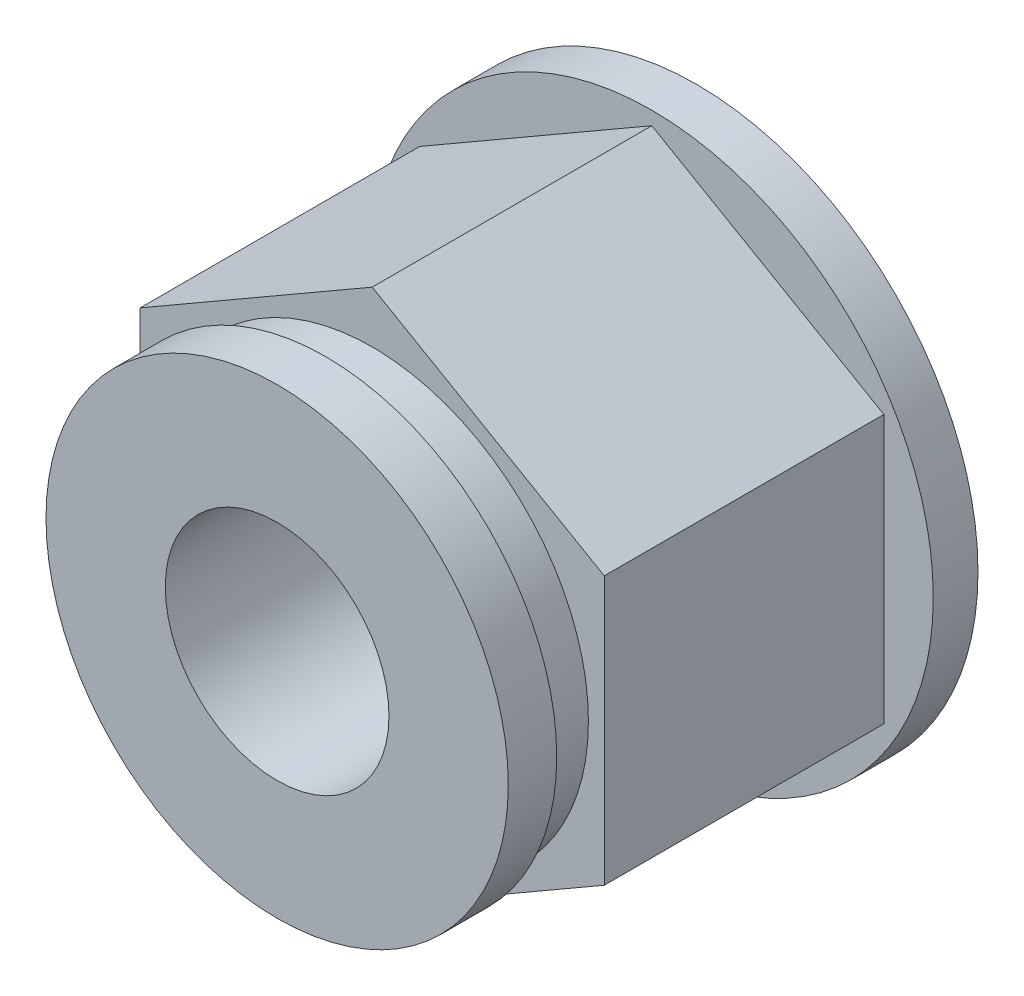
ISO-10303-21;
HEADER;
FILE_DESCRIPTION(('STEP AP214'),'2;1');
FILE_NAME('part.step','',(''),(''),'','','');
FILE_SCHEMA(('AUTOMOTIVE_DESIGN { 1 0 10303 214 1 1 1 1 }'));
ENDSEC;
DATA;
#1=APPLICATION_CONTEXT('core data for automotive mechanical design processes');
#2=APPLICATION_PROTOCOL_DEFINITION('international standard','automotive_design',2000,#1);
#3=PRODUCT_CONTEXT('',#1,'mechanical');
#4=PRODUCT('Part','Part','',(#3));
#5=PRODUCT_RELATED_PRODUCT_CATEGORY('part','',(#4));
#6=PRODUCT_DEFINITION_FORMATION('','',#4);
#7=PRODUCT_DEFINITION_CONTEXT('part definition',#1,'design');
#8=PRODUCT_DEFINITION('design','',#6,#7);
#9=PRODUCT_DEFINITION_SHAPE('','',#8);
#10=(LENGTH_UNIT() NAMED_UNIT(*) SI_UNIT(.MILLI.,.METRE.));
#11=(NAMED_UNIT(*) PLANE_ANGLE_UNIT() SI_UNIT($,.RADIAN.));
#12=(NAMED_UNIT(*) SI_UNIT($,.STERADIAN.) SOLID_ANGLE_UNIT());
#13=UNCERTAINTY_MEASURE_WITH_UNIT(LENGTH_MEASURE(1.E-05),#10,'distance_accuracy_value','');
#14=(GEOMETRIC_REPRESENTATION_CONTEXT(3) GLOBAL_UNCERTAINTY_ASSIGNED_CONTEXT((#13)) GLOBAL_UNIT_ASSIGNED_CONTEXT((#10,
#11,#12)) REPRESENTATION_CONTEXT('',''));
#15=CARTESIAN_POINT('',(0.,0.,0.));
#16=DIRECTION('',(0.,0.,1.));
#17=DIRECTION('',(1.,0.,0.));
#18=AXIS2_PLACEMENT_3D('',#15,#16,#17);
#19=CARTESIAN_POINT('',(6.225,-3.59400542570542,8.7));
#20=DIRECTION('',(0.,0.,1.));
#21=DIRECTION('',(1.,0.,0.));
#22=AXIS2_PLACEMENT_3D('',#19,#20,#21);
#23=PLANE('',#22);
#24=DIRECTION('',(0.866025403784439,0.5,0.));
#25=VECTOR('',#24,1.);
#26=CARTESIAN_POINT('',(0.,-7.18801085141084,8.7));
#27=LINE('',#26,#25);
#28=CARTESIAN_POINT('',(0.,-7.18801085141084,8.7));
#29=VERTEX_POINT('',#28);
#30=CARTESIAN_POINT('',(6.225,-3.59400542570542,8.7));
#31=VERTEX_POINT('',#30);
#32=EDGE_CURVE('E129',#29,#31,#27,.T.);
#33=ORIENTED_EDGE('',*,*,#32,.T.);
#34=DIRECTION('',(0.,1.,0.));
#35=VECTOR('',#34,1.);
#36=CARTESIAN_POINT('',(6.225,-3.59400542570542,8.7));
#37=LINE('',#36,#35);
#38=CARTESIAN_POINT('',(6.225,3.59400542570543,8.7));
#39=VERTEX_POINT('',#38);
#40=EDGE_CURVE('E84',#31,#39,#37,.T.);
#41=ORIENTED_EDGE('',*,*,#40,.T.);
#42=DIRECTION('',(-0.866025403784439,0.5,0.));
#43=VECTOR('',#42,1.);
#44=CARTESIAN_POINT('',(6.225,3.59400542570543,8.7));
#45=LINE('',#44,#43);
#46=CARTESIAN_POINT('',(0.,7.18801085141084,8.7));
#47=VERTEX_POINT('',#46);
#48=EDGE_CURVE('E97',#39,#47,#45,.T.);
#49=ORIENTED_EDGE('',*,*,#48,.T.);
#50=DIRECTION('',(-0.866025403784439,-0.5,0.));
#51=VECTOR('',#50,1.);
#52=CARTESIAN_POINT('',(0.,7.18801085141084,8.7));
#53=LINE('',#52,#51);
#54=CARTESIAN_POINT('',(-6.225,3.59400542570542,8.7));
#55=VERTEX_POINT('',#54);
#56=EDGE_CURVE('E91',#47,#55,#53,.T.);
#57=ORIENTED_EDGE('',*,*,#56,.T.);
#58=DIRECTION('',(0.,-1.,0.));
#59=VECTOR('',#58,1.);
#60=CARTESIAN_POINT('',(-6.225,3.59400542570542,8.7));
#61=LINE('',#60,#59);
#62=CARTESIAN_POINT('',(-6.225,-3.59400542570542,8.7));
#63=VERTEX_POINT('',#62);
#64=EDGE_CURVE('E95',#55,#63,#61,.T.);
#65=ORIENTED_EDGE('',*,*,#64,.T.);
#66=DIRECTION('',(0.866025403784438,-0.5,0.));
#67=VECTOR('',#66,1.);
#68=CARTESIAN_POINT('',(-6.225,-3.59400542570542,8.7));
#69=LINE('',#68,#67);
#70=EDGE_CURVE('E56',#63,#29,#69,.T.);
#71=ORIENTED_EDGE('',*,*,#70,.T.);
#72=EDGE_LOOP('',(#33,#41,#49,#57,#65,#71));
#73=FACE_BOUND('',#72,.T.);
#74=CARTESIAN_POINT('',(0.,0.,8.7));
#75=DIRECTION('',(0.,0.,1.));
#76=DIRECTION('',(1.,0.,0.));
#77=AXIS2_PLACEMENT_3D('',#74,#75,#76);
#78=CIRCLE('',#77,5.8);
#79=CARTESIAN_POINT('',(5.8,0.,8.7));
#80=VERTEX_POINT('',#79);
#81=EDGE_CURVE('E189',#80,#80,#78,.T.);
#82=ORIENTED_EDGE('',*,*,#81,.F.);
#83=EDGE_LOOP('',(#82));
#84=FACE_BOUND('',#83,.T.);
#85=ADVANCED_FACE('F33',(#73,#84),#23,.T.);
#86=CARTESIAN_POINT('',(0.,0.,1.2));
#87=DIRECTION('',(0.,0.,1.));
#88=DIRECTION('',(1.,0.,0.));
#89=AXIS2_PLACEMENT_3D('',#86,#87,#88);
#90=PLANE('',#89);
#91=CARTESIAN_POINT('',(0.,0.,1.2));
#92=DIRECTION('',(0.,0.,1.));
#93=DIRECTION('',(1.,0.,0.));
#94=AXIS2_PLACEMENT_3D('',#91,#92,#93);
#95=CIRCLE('',#94,7.55);
#96=CARTESIAN_POINT('',(7.55,0.,1.2));
#97=VERTEX_POINT('',#96);
#98=EDGE_CURVE('E11',#97,#97,#95,.T.);
#99=ORIENTED_EDGE('',*,*,#98,.T.);
#100=EDGE_LOOP('',(#99));
#101=FACE_BOUND('',#100,.T.);
#102=DIRECTION('',(0.,1.,0.));
#103=VECTOR('',#102,1.);
#104=CARTESIAN_POINT('',(6.225,-3.59400542570542,1.2));
#105=LINE('',#104,#103);
#106=CARTESIAN_POINT('',(6.225,-3.59400542570542,1.2));
#107=VERTEX_POINT('',#106);
#108=CARTESIAN_POINT('',(6.225,3.59400542570543,1.2));
#109=VERTEX_POINT('',#108);
#110=EDGE_CURVE('E120',#107,#109,#105,.T.);
#111=ORIENTED_EDGE('',*,*,#110,.F.);
#112=DIRECTION('',(0.866025403784439,0.5,0.));
#113=VECTOR('',#112,1.);
#114=CARTESIAN_POINT('',(0.,-7.18801085141084,1.2));
#115=LINE('',#114,#113);
#116=CARTESIAN_POINT('',(0.,-7.18801085141084,1.2));
#117=VERTEX_POINT('',#116);
#118=EDGE_CURVE('E117',#117,#107,#115,.T.);
#119=ORIENTED_EDGE('',*,*,#118,.F.);
#120=DIRECTION('',(0.866025403784438,-0.5,0.));
#121=VECTOR('',#120,1.);
#122=CARTESIAN_POINT('',(-6.225,-3.59400542570542,1.2));
#123=LINE('',#122,#121);
#124=CARTESIAN_POINT('',(-6.225,-3.59400542570542,1.2));
#125=VERTEX_POINT('',#124);
#126=EDGE_CURVE('E76',#125,#117,#123,.T.);
#127=ORIENTED_EDGE('',*,*,#126,.F.);
#128=DIRECTION('',(0.,-1.,0.));
#129=VECTOR('',#128,1.);
#130=CARTESIAN_POINT('',(-6.225,3.59400542570542,1.2));
#131=LINE('',#130,#129);
#132=CARTESIAN_POINT('',(-6.225,3.59400542570542,1.2));
#133=VERTEX_POINT('',#132);
#134=EDGE_CURVE('E126',#133,#125,#131,.T.);
#135=ORIENTED_EDGE('',*,*,#134,.F.);
#136=DIRECTION('',(-0.866025403784439,-0.5,0.));
#137=VECTOR('',#136,1.);
#138=CARTESIAN_POINT('',(0.,7.18801085141084,1.2));
#139=LINE('',#138,#137);
#140=CARTESIAN_POINT('',(0.,7.18801085141084,1.2));
#141=VERTEX_POINT('',#140);
#142=EDGE_CURVE('E106',#141,#133,#139,.T.);
#143=ORIENTED_EDGE('',*,*,#142,.F.);
#144=DIRECTION('',(-0.866025403784439,0.5,0.));
#145=VECTOR('',#144,1.);
#146=CARTESIAN_POINT('',(6.225,3.59400542570543,1.2));
#147=LINE('',#146,#145);
#148=EDGE_CURVE('E123',#109,#141,#147,.T.);
#149=ORIENTED_EDGE('',*,*,#148,.F.);
#150=EDGE_LOOP('',(#111,#119,#127,#135,#143,#149));
#151=FACE_BOUND('',#150,.T.);
#152=ADVANCED_FACE('F153',(#101,#151),#90,.T.);
#153=CARTESIAN_POINT('',(0.,0.,1.2));
#154=DIRECTION('',(0.,0.,-1.));
#155=DIRECTION('',(-1.,0.,0.));
#156=AXIS2_PLACEMENT_3D('',#153,#154,#155);
#157=CYLINDRICAL_SURFACE('',#156,7.55);
#158=ORIENTED_EDGE('',*,*,#98,.F.);
#159=EDGE_LOOP('',(#158));
#160=FACE_BOUND('',#159,.T.);
#161=CARTESIAN_POINT('',(0.,0.,0.));
#162=DIRECTION('',(0.,0.,1.));
#163=DIRECTION('',(1.,0.,0.));
#164=AXIS2_PLACEMENT_3D('',#161,#162,#163);
#165=CIRCLE('',#164,7.55);
#166=CARTESIAN_POINT('',(7.55,0.,0.));
#167=VERTEX_POINT('',#166);
#168=EDGE_CURVE('E37',#167,#167,#165,.T.);
#169=ORIENTED_EDGE('',*,*,#168,.T.);
#170=EDGE_LOOP('',(#169));
#171=FACE_BOUND('',#170,.T.);
#172=ADVANCED_FACE('F35',(#160,#171),#157,.T.);
#173=CARTESIAN_POINT('',(0.,0.,0.));
#174=DIRECTION('',(0.,0.,1.));
#175=DIRECTION('',(1.,0.,0.));
#176=AXIS2_PLACEMENT_3D('',#173,#174,#175);
#177=PLANE('',#176);
#178=CARTESIAN_POINT('',(0.,0.,0.));
#179=DIRECTION('',(0.,0.,1.));
#180=DIRECTION('',(1.,0.,0.));
#181=AXIS2_PLACEMENT_3D('',#178,#179,#180);
#182=CIRCLE('',#181,3.);
#183=CARTESIAN_POINT('',(3.,0.,0.));
#184=VERTEX_POINT('',#183);
#185=EDGE_CURVE('E198',#184,#184,#182,.T.);
#186=ORIENTED_EDGE('',*,*,#185,.T.);
#187=EDGE_LOOP('',(#186));
#188=FACE_BOUND('',#187,.T.);
#189=ORIENTED_EDGE('',*,*,#168,.F.);
#190=EDGE_LOOP('',(#189));
#191=FACE_BOUND('',#190,.T.);
#192=ADVANCED_FACE('F142',(#188,#191),#177,.F.);
#193=CARTESIAN_POINT('',(0.,-7.18801085141084,8.7));
#194=DIRECTION('',(-0.5,0.866025403784439,0.));
#195=DIRECTION('',(-0.866025403784439,-0.5,0.));
#196=AXIS2_PLACEMENT_3D('',#193,#194,#195);
#197=PLANE('',#196);
#198=ORIENTED_EDGE('',*,*,#118,.T.);
#199=DIRECTION('',(0.,0.,-1.));
#200=VECTOR('',#199,1.);
#201=CARTESIAN_POINT('',(6.225,-3.59400542570542,8.7));
#202=LINE('',#201,#200);
#203=EDGE_CURVE('E136',#31,#107,#202,.T.);
#204=ORIENTED_EDGE('',*,*,#203,.F.);
#205=ORIENTED_EDGE('',*,*,#32,.F.);
#206=DIRECTION('',(0.,0.,-1.));
#207=VECTOR('',#206,1.);
#208=CARTESIAN_POINT('',(0.,-7.18801085141084,8.7));
#209=LINE('',#208,#207);
#210=EDGE_CURVE('E113',#29,#117,#209,.T.);
#211=ORIENTED_EDGE('',*,*,#210,.T.);
#212=EDGE_LOOP('',(#198,#204,#205,#211));
#213=FACE_BOUND('',#212,.T.);
#214=ADVANCED_FACE('F144',(#213),#197,.F.);
#215=CARTESIAN_POINT('',(6.225,-3.59400542570542,8.7));
#216=DIRECTION('',(-1.,0.,0.));
#217=DIRECTION('',(0.,-1.,0.));
#218=AXIS2_PLACEMENT_3D('',#215,#216,#217);
#219=PLANE('',#218);
#220=ORIENTED_EDGE('',*,*,#110,.T.);
#221=DIRECTION('',(0.,0.,-1.));
#222=VECTOR('',#221,1.);
#223=CARTESIAN_POINT('',(6.225,3.59400542570543,8.7));
#224=LINE('',#223,#222);
#225=EDGE_CURVE('E133',#39,#109,#224,.T.);
#226=ORIENTED_EDGE('',*,*,#225,.F.);
#227=ORIENTED_EDGE('',*,*,#40,.F.);
#228=ORIENTED_EDGE('',*,*,#203,.T.);
#229=EDGE_LOOP('',(#220,#226,#227,#228));
#230=FACE_BOUND('',#229,.T.);
#231=ADVANCED_FACE('F150',(#230),#219,.F.);
#232=CARTESIAN_POINT('',(6.225,3.59400542570543,8.7));
#233=DIRECTION('',(-0.5,-0.866025403784439,0.));
#234=DIRECTION('',(0.866025403784439,-0.5,0.));
#235=AXIS2_PLACEMENT_3D('',#232,#233,#234);
#236=PLANE('',#235);
#237=ORIENTED_EDGE('',*,*,#148,.T.);
#238=DIRECTION('',(0.,0.,-1.));
#239=VECTOR('',#238,1.);
#240=CARTESIAN_POINT('',(0.,7.18801085141084,8.7));
#241=LINE('',#240,#239);
#242=EDGE_CURVE('E109',#47,#141,#241,.T.);
#243=ORIENTED_EDGE('',*,*,#242,.F.);
#244=ORIENTED_EDGE('',*,*,#48,.F.);
#245=ORIENTED_EDGE('',*,*,#225,.T.);
#246=EDGE_LOOP('',(#237,#243,#244,#245));
#247=FACE_BOUND('',#246,.T.);
#248=ADVANCED_FACE('F174',(#247),#236,.F.);
#249=CARTESIAN_POINT('',(0.,7.18801085141084,8.7));
#250=DIRECTION('',(0.5,-0.866025403784439,0.));
#251=DIRECTION('',(0.866025403784439,0.5,0.));
#252=AXIS2_PLACEMENT_3D('',#249,#250,#251);
#253=PLANE('',#252);
#254=ORIENTED_EDGE('',*,*,#142,.T.);
#255=DIRECTION('',(0.,0.,-1.));
#256=VECTOR('',#255,1.);
#257=CARTESIAN_POINT('',(-6.225,3.59400542570542,8.7));
#258=LINE('',#257,#256);
#259=EDGE_CURVE('E103',#55,#133,#258,.T.);
#260=ORIENTED_EDGE('',*,*,#259,.F.);
#261=ORIENTED_EDGE('',*,*,#56,.F.);
#262=ORIENTED_EDGE('',*,*,#242,.T.);
#263=EDGE_LOOP('',(#254,#260,#261,#262));
#264=FACE_BOUND('',#263,.T.);
#265=ADVANCED_FACE('F104',(#264),#253,.F.);
#266=CARTESIAN_POINT('',(-6.225,3.59400542570542,8.7));
#267=DIRECTION('',(1.,0.,0.));
#268=DIRECTION('',(0.,0.,-1.));
#269=AXIS2_PLACEMENT_3D('',#266,#267,#268);
#270=PLANE('',#269);
#271=ORIENTED_EDGE('',*,*,#134,.T.);
#272=DIRECTION('',(0.,0.,-1.));
#273=VECTOR('',#272,1.);
#274=CARTESIAN_POINT('',(-6.225,-3.59400542570542,8.7));
#275=LINE('',#274,#273);
#276=EDGE_CURVE('E48',#63,#125,#275,.T.);
#277=ORIENTED_EDGE('',*,*,#276,.F.);
#278=ORIENTED_EDGE('',*,*,#64,.F.);
#279=ORIENTED_EDGE('',*,*,#259,.T.);
#280=EDGE_LOOP('',(#271,#277,#278,#279));
#281=FACE_BOUND('',#280,.T.);
#282=ADVANCED_FACE('F111',(#281),#270,.F.);
#283=CARTESIAN_POINT('',(-6.225,-3.59400542570542,8.7));
#284=DIRECTION('',(0.5,0.866025403784438,0.));
#285=DIRECTION('',(-0.866025403784439,0.5,0.));
#286=AXIS2_PLACEMENT_3D('',#283,#284,#285);
#287=PLANE('',#286);
#288=ORIENTED_EDGE('',*,*,#126,.T.);
#289=ORIENTED_EDGE('',*,*,#210,.F.);
#290=ORIENTED_EDGE('',*,*,#70,.F.);
#291=ORIENTED_EDGE('',*,*,#276,.T.);
#292=EDGE_LOOP('',(#288,#289,#290,#291));
#293=FACE_BOUND('',#292,.T.);
#294=ADVANCED_FACE('F167',(#293),#287,.F.);
#295=CARTESIAN_POINT('',(0.,0.,9.95));
#296=DIRECTION('',(0.,0.,-1.));
#297=DIRECTION('',(-1.,0.,0.));
#298=AXIS2_PLACEMENT_3D('',#295,#296,#297);
#299=CYLINDRICAL_SURFACE('',#298,5.8);
#300=CARTESIAN_POINT('',(0.,0.,9.95));
#301=DIRECTION('',(0.,0.,1.));
#302=DIRECTION('',(1.,0.,0.));
#303=AXIS2_PLACEMENT_3D('',#300,#301,#302);
#304=CIRCLE('',#303,5.8);
#305=CARTESIAN_POINT('',(5.8,0.,9.95));
#306=VERTEX_POINT('',#305);
#307=EDGE_CURVE('E121',#306,#306,#304,.T.);
#308=ORIENTED_EDGE('',*,*,#307,.F.);
#309=EDGE_LOOP('',(#308));
#310=FACE_BOUND('',#309,.T.);
#311=ORIENTED_EDGE('',*,*,#81,.T.);
#312=EDGE_LOOP('',(#311));
#313=FACE_BOUND('',#312,.T.);
#314=ADVANCED_FACE('F165',(#310,#313),#299,.T.);
#315=CARTESIAN_POINT('',(0.,0.,9.95));
#316=DIRECTION('',(0.,0.,1.));
#317=DIRECTION('',(1.,0.,0.));
#318=AXIS2_PLACEMENT_3D('',#315,#316,#317);
#319=PLANE('',#318);
#320=CARTESIAN_POINT('',(0.,0.,9.95));
#321=DIRECTION('',(0.,0.,1.));
#322=DIRECTION('',(1.,0.,0.));
#323=AXIS2_PLACEMENT_3D('',#320,#321,#322);
#324=CIRCLE('',#323,6.2);
#325=CARTESIAN_POINT('',(6.2,0.,9.95));
#326=VERTEX_POINT('',#325);
#327=EDGE_CURVE('E195',#326,#326,#324,.T.);
#328=ORIENTED_EDGE('',*,*,#327,.F.);
#329=EDGE_LOOP('',(#328));
#330=FACE_BOUND('',#329,.T.);
#331=ORIENTED_EDGE('',*,*,#307,.T.);
#332=EDGE_LOOP('',(#331));
#333=FACE_BOUND('',#332,.T.);
#334=ADVANCED_FACE('F221',(#330,#333),#319,.F.);
#335=CARTESIAN_POINT('',(0.,0.,11.25));
#336=DIRECTION('',(0.,0.,-1.));
#337=DIRECTION('',(-1.,0.,0.));
#338=AXIS2_PLACEMENT_3D('',#335,#336,#337);
#339=CYLINDRICAL_SURFACE('',#338,6.2);
#340=CARTESIAN_POINT('',(0.,0.,11.25));
#341=DIRECTION('',(0.,0.,1.));
#342=DIRECTION('',(1.,0.,0.));
#343=AXIS2_PLACEMENT_3D('',#340,#341,#342);
#344=CIRCLE('',#343,6.2);
#345=CARTESIAN_POINT('',(6.2,0.,11.25));
#346=VERTEX_POINT('',#345);
#347=EDGE_CURVE('E192',#346,#346,#344,.T.);
#348=ORIENTED_EDGE('',*,*,#347,.F.);
#349=EDGE_LOOP('',(#348));
#350=FACE_BOUND('',#349,.T.);
#351=ORIENTED_EDGE('',*,*,#327,.T.);
#352=EDGE_LOOP('',(#351));
#353=FACE_BOUND('',#352,.T.);
#354=ADVANCED_FACE('F215',(#350,#353),#339,.T.);
#355=CARTESIAN_POINT('',(0.,0.,11.25));
#356=DIRECTION('',(0.,0.,1.));
#357=DIRECTION('',(1.,0.,0.));
#358=AXIS2_PLACEMENT_3D('',#355,#356,#357);
#359=PLANE('',#358);
#360=CARTESIAN_POINT('',(0.,0.,11.25));
#361=DIRECTION('',(0.,0.,1.));
#362=DIRECTION('',(1.,0.,0.));
#363=AXIS2_PLACEMENT_3D('',#360,#361,#362);
#364=CIRCLE('',#363,3.);
#365=CARTESIAN_POINT('',(3.,0.,11.25));
#366=VERTEX_POINT('',#365);
#367=EDGE_CURVE('E201',#366,#366,#364,.T.);
#368=ORIENTED_EDGE('',*,*,#367,.F.);
#369=EDGE_LOOP('',(#368));
#370=FACE_BOUND('',#369,.T.);
#371=ORIENTED_EDGE('',*,*,#347,.T.);
#372=EDGE_LOOP('',(#371));
#373=FACE_BOUND('',#372,.T.);
#374=ADVANCED_FACE('F209',(#370,#373),#359,.T.);
#375=CARTESIAN_POINT('',(0.,0.,0.));
#376=DIRECTION('',(0.,0.,1.));
#377=DIRECTION('',(1.,0.,0.));
#378=AXIS2_PLACEMENT_3D('',#375,#376,#377);
#379=CYLINDRICAL_SURFACE('',#378,3.);
#380=CARTESIAN_POINT('',(3.,0.,0.));
#381=CARTESIAN_POINT('',(3.,0.,0.1171875));
#382=CARTESIAN_POINT('',(3.,0.,0.234375));
#383=CARTESIAN_POINT('',(3.,0.,0.46875));
#384=CARTESIAN_POINT('',(3.,0.,0.5859375));
#385=CARTESIAN_POINT('',(3.,0.,0.8203125));
#386=CARTESIAN_POINT('',(3.,0.,0.9375));
#387=CARTESIAN_POINT('',(3.,0.,1.171875));
#388=CARTESIAN_POINT('',(3.,0.,1.2890625));
#389=CARTESIAN_POINT('',(3.,0.,1.5234375));
#390=CARTESIAN_POINT('',(3.,0.,1.640625));
#391=CARTESIAN_POINT('',(3.,0.,1.875));
#392=CARTESIAN_POINT('',(3.,0.,1.9921875));
#393=CARTESIAN_POINT('',(3.,0.,2.2265625));
#394=CARTESIAN_POINT('',(3.,0.,2.34375));
#395=CARTESIAN_POINT('',(3.,0.,2.578125));
#396=CARTESIAN_POINT('',(3.,0.,2.6953125));
#397=CARTESIAN_POINT('',(3.,0.,2.9296875));
#398=CARTESIAN_POINT('',(3.,0.,3.046875));
#399=CARTESIAN_POINT('',(3.,0.,3.28125));
#400=CARTESIAN_POINT('',(3.,0.,3.3984375));
#401=CARTESIAN_POINT('',(3.,0.,3.6328125));
#402=CARTESIAN_POINT('',(3.,0.,3.75));
#403=CARTESIAN_POINT('',(3.,0.,3.984375));
#404=CARTESIAN_POINT('',(3.,0.,4.1015625));
#405=CARTESIAN_POINT('',(3.,0.,4.3359375));
#406=CARTESIAN_POINT('',(3.,0.,4.453125));
#407=CARTESIAN_POINT('',(3.,0.,4.6875));
#408=CARTESIAN_POINT('',(3.,0.,4.8046875));
#409=CARTESIAN_POINT('',(3.,0.,5.0390625));
#410=CARTESIAN_POINT('',(3.,0.,5.15625));
#411=CARTESIAN_POINT('',(3.,0.,5.390625));
#412=CARTESIAN_POINT('',(3.,0.,5.5078125));
#413=CARTESIAN_POINT('',(3.,0.,5.7421875));
#414=CARTESIAN_POINT('',(3.,0.,5.859375));
#415=CARTESIAN_POINT('',(3.,0.,6.09375));
#416=CARTESIAN_POINT('',(3.,0.,6.2109375));
#417=CARTESIAN_POINT('',(3.,0.,6.4453125));
#418=CARTESIAN_POINT('',(3.,0.,6.5625));
#419=CARTESIAN_POINT('',(3.,0.,6.796875));
#420=CARTESIAN_POINT('',(3.,0.,6.9140625));
#421=CARTESIAN_POINT('',(3.,0.,7.1484375));
#422=CARTESIAN_POINT('',(3.,0.,7.265625));
#423=CARTESIAN_POINT('',(3.,0.,7.5));
#424=CARTESIAN_POINT('',(3.,0.,7.6171875));
#425=CARTESIAN_POINT('',(3.,0.,7.8515625));
#426=CARTESIAN_POINT('',(3.,0.,7.96875));
#427=CARTESIAN_POINT('',(3.,0.,8.203125));
#428=CARTESIAN_POINT('',(3.,0.,8.3203125));
#429=CARTESIAN_POINT('',(3.,0.,8.5546875));
#430=CARTESIAN_POINT('',(3.,0.,8.671875));
#431=CARTESIAN_POINT('',(3.,0.,8.90625));
#432=CARTESIAN_POINT('',(3.,0.,9.0234375));
#433=CARTESIAN_POINT('',(3.,0.,9.2578125));
#434=CARTESIAN_POINT('',(3.,0.,9.375));
#435=CARTESIAN_POINT('',(3.,0.,9.609375));
#436=CARTESIAN_POINT('',(3.,0.,9.7265625));
#437=CARTESIAN_POINT('',(3.,0.,9.9609375));
#438=CARTESIAN_POINT('',(3.,0.,10.078125));
#439=CARTESIAN_POINT('',(3.,0.,10.3125));
#440=CARTESIAN_POINT('',(3.,0.,10.4296875));
#441=CARTESIAN_POINT('',(3.,0.,10.6640625));
#442=CARTESIAN_POINT('',(3.,0.,10.78125));
#443=CARTESIAN_POINT('',(3.,0.,11.015625));
#444=CARTESIAN_POINT('',(3.,0.,11.1328125));
#445=CARTESIAN_POINT('',(3.,0.,11.25));
#446=B_SPLINE_CURVE_WITH_KNOTS('',3,(#380,#381,#382,#383,#384,#385,#386,#387,#388,#389,#390,
#391,#392,#393,#394,#395,#396,#397,#398,#399,#400,#401,#402,#403,#404,#405,#406,#407,#408,#409,
#410,#411,#412,#413,#414,#415,#416,#417,#418,#419,#420,#421,#422,#423,#424,#425,#426,#427,#428,
#429,#430,#431,#432,#433,#434,#435,#436,#437,#438,#439,#440,#441,#442,#443,#444,#445),
.UNSPECIFIED.,.F.,.F.,(4,2,2,2,2,2,2,2,2,2,2,2,2,2,2,2,2,2,2,2,2,2,2,2,2,2,2,2,2,2,2,2,4),(0.,
0.3515625,0.703125,1.0546875,1.40625,1.7578125,2.109375,2.4609375,2.8125,3.1640625,3.515625,
3.8671875,4.21875,4.5703125,4.921875,5.2734375,5.625,5.9765625,6.328125,6.6796875,7.03125,
7.3828125,7.734375,8.0859375,8.4375,8.7890625,9.140625,9.4921875,9.84375,10.1953125,10.546875,
10.8984375,11.25),.UNSPECIFIED.);
#447=EDGE_CURVE('BSEAM206',#184,#366,#446,.T.);
#448=ORIENTED_EDGE('',*,*,#185,.F.);
#449=ORIENTED_EDGE('',*,*,#367,.T.);
#450=ORIENTED_EDGE('',*,*,#447,.T.);
#451=ORIENTED_EDGE('',*,*,#447,.F.);
#452=EDGE_LOOP('',(#448,#450,#449,#451));
#453=FACE_BOUND('',#452,.T.);
#454=ADVANCED_FACE('F206',(#453),#379,.F.);
#455=CLOSED_SHELL('',(#85,#152,#172,#192,#214,#231,#248,#265,#282,#294,#314,#334,#354,#374,#454));
#456=MANIFOLD_SOLID_BREP('B2',#455);
#457=ADVANCED_BREP_SHAPE_REPRESENTATION('',(#18,#456),#14);
#458=SHAPE_DEFINITION_REPRESENTATION(#9,#457);
ENDSEC;
END-ISO-10303-21;
